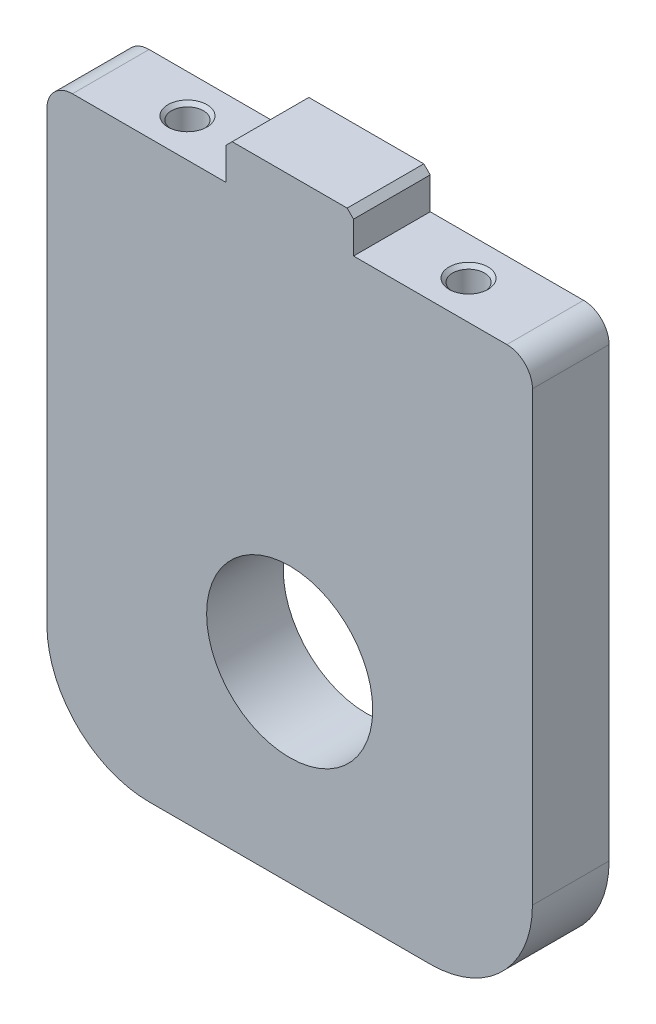
ISO-10303-21;
HEADER;
FILE_DESCRIPTION(('STEP AP214'),'2;1');
FILE_NAME('part.step','',(''),(''),'','','');
FILE_SCHEMA(('AUTOMOTIVE_DESIGN { 1 0 10303 214 1 1 1 1 }'));
ENDSEC;
DATA;
#1=APPLICATION_CONTEXT('core data for automotive mechanical design processes');
#2=APPLICATION_PROTOCOL_DEFINITION('international standard','automotive_design',2000,#1);
#3=PRODUCT_CONTEXT('',#1,'mechanical');
#4=PRODUCT('Part','Part','',(#3));
#5=PRODUCT_RELATED_PRODUCT_CATEGORY('part','',(#4));
#6=PRODUCT_DEFINITION_FORMATION('','',#4);
#7=PRODUCT_DEFINITION_CONTEXT('part definition',#1,'design');
#8=PRODUCT_DEFINITION('design','',#6,#7);
#9=PRODUCT_DEFINITION_SHAPE('','',#8);
#10=(LENGTH_UNIT() NAMED_UNIT(*) SI_UNIT(.MILLI.,.METRE.));
#11=(NAMED_UNIT(*) PLANE_ANGLE_UNIT() SI_UNIT($,.RADIAN.));
#12=(NAMED_UNIT(*) SI_UNIT($,.STERADIAN.) SOLID_ANGLE_UNIT());
#13=UNCERTAINTY_MEASURE_WITH_UNIT(LENGTH_MEASURE(1.E-05),#10,'distance_accuracy_value','');
#14=(GEOMETRIC_REPRESENTATION_CONTEXT(3) GLOBAL_UNCERTAINTY_ASSIGNED_CONTEXT((#13)) GLOBAL_UNIT_ASSIGNED_CONTEXT((#10,
#11,#12)) REPRESENTATION_CONTEXT('',''));
#15=CARTESIAN_POINT('',(0.,0.,0.));
#16=DIRECTION('',(0.,0.,1.));
#17=DIRECTION('',(1.,0.,0.));
#18=AXIS2_PLACEMENT_3D('',#15,#16,#17);
#19=CARTESIAN_POINT('',(-19.,22.5,6.));
#20=DIRECTION('',(0.,-1.,0.));
#21=DIRECTION('',(0.,0.,-1.));
#22=AXIS2_PLACEMENT_3D('',#19,#20,#21);
#23=PLANE('',#22);
#24=CARTESIAN_POINT('',(-11.,22.5,3.));
#25=DIRECTION('',(0.,1.,0.));
#26=DIRECTION('',(0.,0.,1.));
#27=AXIS2_PLACEMENT_3D('',#24,#25,#26);
#28=CIRCLE('',#27,1.525);
#29=CARTESIAN_POINT('',(-11.,22.5,4.525));
#30=VERTEX_POINT('',#29);
#31=EDGE_CURVE('E163',#30,#30,#28,.T.);
#32=ORIENTED_EDGE('',*,*,#31,.F.);
#33=EDGE_LOOP('',(#32));
#34=FACE_BOUND('',#33,.T.);
#35=DIRECTION('',(-1.,0.,0.));
#36=VECTOR('',#35,1.);
#37=CARTESIAN_POINT('',(-19.,22.5,6.));
#38=LINE('',#37,#36);
#39=CARTESIAN_POINT('',(-5.,22.5,6.));
#40=VERTEX_POINT('',#39);
#41=CARTESIAN_POINT('',(-17.,22.5,6.));
#42=VERTEX_POINT('',#41);
#43=EDGE_CURVE('E200',#40,#42,#38,.T.);
#44=ORIENTED_EDGE('',*,*,#43,.F.);
#45=DIRECTION('',(0.,0.,1.));
#46=VECTOR('',#45,1.);
#47=CARTESIAN_POINT('',(-5.,22.5,-10.4403065089105));
#48=LINE('',#47,#46);
#49=CARTESIAN_POINT('',(-5.,22.5,0.));
#50=VERTEX_POINT('',#49);
#51=EDGE_CURVE('E176',#50,#40,#48,.T.);
#52=ORIENTED_EDGE('',*,*,#51,.F.);
#53=DIRECTION('',(-1.,0.,0.));
#54=VECTOR('',#53,1.);
#55=CARTESIAN_POINT('',(-19.,22.5,0.));
#56=LINE('',#55,#54);
#57=CARTESIAN_POINT('',(-17.,22.5,0.));
#58=VERTEX_POINT('',#57);
#59=EDGE_CURVE('E213',#50,#58,#56,.T.);
#60=ORIENTED_EDGE('',*,*,#59,.T.);
#61=DIRECTION('',(0.,0.,-1.));
#62=VECTOR('',#61,1.);
#63=CARTESIAN_POINT('',(-17.,22.5,6.));
#64=LINE('',#63,#62);
#65=EDGE_CURVE('E233',#58,#42,#64,.F.);
#66=ORIENTED_EDGE('',*,*,#65,.T.);
#67=EDGE_LOOP('',(#44,#52,#60,#66));
#68=FACE_BOUND('',#67,.T.);
#69=ADVANCED_FACE('F39',(#34,#68),#23,.F.);
#70=CARTESIAN_POINT('',(19.,22.5,6.));
#71=DIRECTION('',(-1.,0.,0.));
#72=DIRECTION('',(0.,-1.,0.));
#73=AXIS2_PLACEMENT_3D('',#70,#71,#72);
#74=PLANE('',#73);
#75=DIRECTION('',(0.,1.,0.));
#76=VECTOR('',#75,1.);
#77=CARTESIAN_POINT('',(19.,22.5,6.));
#78=LINE('',#77,#76);
#79=CARTESIAN_POINT('',(19.,-14.5,6.));
#80=VERTEX_POINT('',#79);
#81=CARTESIAN_POINT('',(19.,20.5,6.));
#82=VERTEX_POINT('',#81);
#83=EDGE_CURVE('E198',#80,#82,#78,.T.);
#84=ORIENTED_EDGE('',*,*,#83,.F.);
#85=DIRECTION('',(0.,0.,-1.));
#86=VECTOR('',#85,1.);
#87=CARTESIAN_POINT('',(19.,-14.5,6.));
#88=LINE('',#87,#86);
#89=CARTESIAN_POINT('',(19.,-14.5,0.));
#90=VERTEX_POINT('',#89);
#91=EDGE_CURVE('E258',#80,#90,#88,.T.);
#92=ORIENTED_EDGE('',*,*,#91,.T.);
#93=DIRECTION('',(0.,1.,0.));
#94=VECTOR('',#93,1.);
#95=CARTESIAN_POINT('',(19.,22.5,0.));
#96=LINE('',#95,#94);
#97=CARTESIAN_POINT('',(19.,20.5,0.));
#98=VERTEX_POINT('',#97);
#99=EDGE_CURVE('E195',#90,#98,#96,.T.);
#100=ORIENTED_EDGE('',*,*,#99,.T.);
#101=DIRECTION('',(0.,0.,-1.));
#102=VECTOR('',#101,1.);
#103=CARTESIAN_POINT('',(19.,20.5,6.));
#104=LINE('',#103,#102);
#105=EDGE_CURVE('E240',#98,#82,#104,.F.);
#106=ORIENTED_EDGE('',*,*,#105,.T.);
#107=EDGE_LOOP('',(#84,#92,#100,#106));
#108=FACE_BOUND('',#107,.T.);
#109=ADVANCED_FACE('F320',(#108),#74,.F.);
#110=CARTESIAN_POINT('',(11.,22.5,3.));
#111=DIRECTION('',(0.,1.,0.));
#112=DIRECTION('',(0.,0.,1.));
#113=AXIS2_PLACEMENT_3D('',#110,#111,#112);
#114=CIRCLE('',#113,1.525);
#115=CARTESIAN_POINT('',(11.,22.5,4.525));
#116=VERTEX_POINT('',#115);
#117=EDGE_CURVE('E156',#116,#116,#114,.T.);
#118=ORIENTED_EDGE('',*,*,#117,.F.);
#119=EDGE_LOOP('',(#118));
#120=FACE_BOUND('',#119,.T.);
#121=CARTESIAN_POINT('',(17.,22.5,0.));
#122=VERTEX_POINT('',#121);
#123=CARTESIAN_POINT('',(5.,22.5,0.));
#124=VERTEX_POINT('',#123);
#125=EDGE_CURVE('E214',#122,#124,#56,.T.);
#126=ORIENTED_EDGE('',*,*,#125,.T.);
#127=DIRECTION('',(0.,0.,1.));
#128=VECTOR('',#127,1.);
#129=CARTESIAN_POINT('',(5.,22.5,-10.4403065089105));
#130=LINE('',#129,#128);
#131=CARTESIAN_POINT('',(5.,22.5,6.));
#132=VERTEX_POINT('',#131);
#133=EDGE_CURVE('E186',#124,#132,#130,.T.);
#134=ORIENTED_EDGE('',*,*,#133,.T.);
#135=CARTESIAN_POINT('',(17.,22.5,6.));
#136=VERTEX_POINT('',#135);
#137=EDGE_CURVE('E202',#136,#132,#38,.T.);
#138=ORIENTED_EDGE('',*,*,#137,.F.);
#139=DIRECTION('',(0.,0.,-1.));
#140=VECTOR('',#139,1.);
#141=CARTESIAN_POINT('',(17.,22.5,6.));
#142=LINE('',#141,#140);
#143=EDGE_CURVE('E230',#136,#122,#142,.T.);
#144=ORIENTED_EDGE('',*,*,#143,.T.);
#145=EDGE_LOOP('',(#126,#134,#138,#144));
#146=FACE_BOUND('',#145,.T.);
#147=ADVANCED_FACE('F329',(#120,#146),#23,.F.);
#148=CARTESIAN_POINT('',(-19.,22.5,6.));
#149=DIRECTION('',(1.,0.,0.));
#150=DIRECTION('',(0.,1.,0.));
#151=AXIS2_PLACEMENT_3D('',#148,#149,#150);
#152=PLANE('',#151);
#153=DIRECTION('',(0.,-1.,0.));
#154=VECTOR('',#153,1.);
#155=CARTESIAN_POINT('',(-19.,22.5,0.));
#156=LINE('',#155,#154);
#157=CARTESIAN_POINT('',(-19.,20.5,0.));
#158=VERTEX_POINT('',#157);
#159=CARTESIAN_POINT('',(-19.,-14.5,0.));
#160=VERTEX_POINT('',#159);
#161=EDGE_CURVE('E217',#158,#160,#156,.T.);
#162=ORIENTED_EDGE('',*,*,#161,.T.);
#163=DIRECTION('',(0.,0.,-1.));
#164=VECTOR('',#163,1.);
#165=CARTESIAN_POINT('',(-19.,-14.5,6.));
#166=LINE('',#165,#164);
#167=CARTESIAN_POINT('',(-19.,-14.5,6.));
#168=VERTEX_POINT('',#167);
#169=EDGE_CURVE('E252',#160,#168,#166,.F.);
#170=ORIENTED_EDGE('',*,*,#169,.T.);
#171=DIRECTION('',(0.,-1.,0.));
#172=VECTOR('',#171,1.);
#173=CARTESIAN_POINT('',(-19.,22.5,6.));
#174=LINE('',#173,#172);
#175=CARTESIAN_POINT('',(-19.,20.5,6.));
#176=VERTEX_POINT('',#175);
#177=EDGE_CURVE('E205',#176,#168,#174,.T.);
#178=ORIENTED_EDGE('',*,*,#177,.F.);
#179=DIRECTION('',(0.,0.,-1.));
#180=VECTOR('',#179,1.);
#181=CARTESIAN_POINT('',(-19.,20.5,6.));
#182=LINE('',#181,#180);
#183=EDGE_CURVE('E211',#176,#158,#182,.T.);
#184=ORIENTED_EDGE('',*,*,#183,.T.);
#185=EDGE_LOOP('',(#162,#170,#178,#184));
#186=FACE_BOUND('',#185,.T.);
#187=ADVANCED_FACE('F302',(#186),#152,.F.);
#188=CARTESIAN_POINT('',(-19.,-22.5,6.));
#189=DIRECTION('',(0.,1.,0.));
#190=DIRECTION('',(0.,0.,1.));
#191=AXIS2_PLACEMENT_3D('',#188,#189,#190);
#192=PLANE('',#191);
#193=DIRECTION('',(1.,0.,0.));
#194=VECTOR('',#193,1.);
#195=CARTESIAN_POINT('',(-19.,-22.5,6.));
#196=LINE('',#195,#194);
#197=CARTESIAN_POINT('',(-11.,-22.5,6.));
#198=VERTEX_POINT('',#197);
#199=CARTESIAN_POINT('',(11.,-22.5,6.));
#200=VERTEX_POINT('',#199);
#201=EDGE_CURVE('E208',#198,#200,#196,.T.);
#202=ORIENTED_EDGE('',*,*,#201,.F.);
#203=DIRECTION('',(0.,0.,-1.));
#204=VECTOR('',#203,1.);
#205=CARTESIAN_POINT('',(-11.,-22.5,6.));
#206=LINE('',#205,#204);
#207=CARTESIAN_POINT('',(-11.,-22.5,0.));
#208=VERTEX_POINT('',#207);
#209=EDGE_CURVE('E245',#198,#208,#206,.T.);
#210=ORIENTED_EDGE('',*,*,#209,.T.);
#211=DIRECTION('',(1.,0.,0.));
#212=VECTOR('',#211,1.);
#213=CARTESIAN_POINT('',(-19.,-22.5,0.));
#214=LINE('',#213,#212);
#215=CARTESIAN_POINT('',(11.,-22.5,0.));
#216=VERTEX_POINT('',#215);
#217=EDGE_CURVE('E201',#208,#216,#214,.T.);
#218=ORIENTED_EDGE('',*,*,#217,.T.);
#219=DIRECTION('',(0.,0.,-1.));
#220=VECTOR('',#219,1.);
#221=CARTESIAN_POINT('',(11.,-22.5,6.));
#222=LINE('',#221,#220);
#223=EDGE_CURVE('E243',#216,#200,#222,.F.);
#224=ORIENTED_EDGE('',*,*,#223,.T.);
#225=EDGE_LOOP('',(#202,#210,#218,#224));
#226=FACE_BOUND('',#225,.T.);
#227=ADVANCED_FACE('F313',(#226),#192,.F.);
#228=CARTESIAN_POINT('',(0.,0.,6.));
#229=DIRECTION('',(0.,0.,1.));
#230=DIRECTION('',(1.,0.,0.));
#231=AXIS2_PLACEMENT_3D('',#228,#229,#230);
#232=PLANE('',#231);
#233=CARTESIAN_POINT('',(0.,-7.5,6.));
#234=DIRECTION('',(0.,0.,1.));
#235=DIRECTION('',(1.,0.,0.));
#236=AXIS2_PLACEMENT_3D('',#233,#234,#235);
#237=CIRCLE('',#236,6.5);
#238=CARTESIAN_POINT('',(6.5,-7.5,6.));
#239=VERTEX_POINT('',#238);
#240=EDGE_CURVE('E191',#239,#239,#237,.T.);
#241=ORIENTED_EDGE('',*,*,#240,.F.);
#242=EDGE_LOOP('',(#241));
#243=FACE_BOUND('',#242,.T.);
#244=DIRECTION('',(0.,1.,0.));
#245=VECTOR('',#244,1.);
#246=CARTESIAN_POINT('',(5.,22.5,6.));
#247=LINE('',#246,#245);
#248=CARTESIAN_POINT('',(5.,25.,6.));
#249=VERTEX_POINT('',#248);
#250=EDGE_CURVE('E172',#132,#249,#247,.T.);
#251=ORIENTED_EDGE('',*,*,#250,.T.);
#252=DIRECTION('',(0.707106781186548,-0.707106781186548,0.));
#253=VECTOR('',#252,1.);
#254=CARTESIAN_POINT('',(15.,15.,6.));
#255=LINE('',#254,#253);
#256=CARTESIAN_POINT('',(4.5,25.5,6.));
#257=VERTEX_POINT('',#256);
#258=EDGE_CURVE('E266',#249,#257,#255,.F.);
#259=ORIENTED_EDGE('',*,*,#258,.T.);
#260=DIRECTION('',(-1.,0.,0.));
#261=VECTOR('',#260,1.);
#262=CARTESIAN_POINT('',(-5.,25.5,6.));
#263=LINE('',#262,#261);
#264=CARTESIAN_POINT('',(-4.49999999999999,25.5,6.));
#265=VERTEX_POINT('',#264);
#266=EDGE_CURVE('E181',#257,#265,#263,.T.);
#267=ORIENTED_EDGE('',*,*,#266,.T.);
#268=DIRECTION('',(0.707106781186548,0.707106781186548,0.));
#269=VECTOR('',#268,1.);
#270=CARTESIAN_POINT('',(-15.,15.,6.));
#271=LINE('',#270,#269);
#272=CARTESIAN_POINT('',(-5.,25.,6.));
#273=VERTEX_POINT('',#272);
#274=EDGE_CURVE('E264',#265,#273,#271,.F.);
#275=ORIENTED_EDGE('',*,*,#274,.T.);
#276=DIRECTION('',(0.,-1.,0.));
#277=VECTOR('',#276,1.);
#278=CARTESIAN_POINT('',(-5.,22.5,6.));
#279=LINE('',#278,#277);
#280=EDGE_CURVE('E184',#273,#40,#279,.T.);
#281=ORIENTED_EDGE('',*,*,#280,.T.);
#282=ORIENTED_EDGE('',*,*,#43,.T.);
#283=CARTESIAN_POINT('',(-17.,20.5,6.));
#284=DIRECTION('',(0.,0.,1.));
#285=DIRECTION('',(1.,0.,0.));
#286=AXIS2_PLACEMENT_3D('',#283,#284,#285);
#287=CIRCLE('',#286,2.);
#288=EDGE_CURVE('E238',#42,#176,#287,.T.);
#289=ORIENTED_EDGE('',*,*,#288,.T.);
#290=ORIENTED_EDGE('',*,*,#177,.T.);
#291=CARTESIAN_POINT('',(-11.,-14.5,6.));
#292=DIRECTION('',(0.,0.,1.));
#293=DIRECTION('',(1.,0.,0.));
#294=AXIS2_PLACEMENT_3D('',#291,#292,#293);
#295=CIRCLE('',#294,8.);
#296=EDGE_CURVE('E256',#168,#198,#295,.T.);
#297=ORIENTED_EDGE('',*,*,#296,.T.);
#298=ORIENTED_EDGE('',*,*,#201,.T.);
#299=CARTESIAN_POINT('',(11.,-14.5,6.));
#300=DIRECTION('',(0.,0.,1.));
#301=DIRECTION('',(1.,0.,0.));
#302=AXIS2_PLACEMENT_3D('',#299,#300,#301);
#303=CIRCLE('',#302,8.);
#304=EDGE_CURVE('E254',#200,#80,#303,.T.);
#305=ORIENTED_EDGE('',*,*,#304,.T.);
#306=ORIENTED_EDGE('',*,*,#83,.T.);
#307=CARTESIAN_POINT('',(17.,20.5,6.));
#308=DIRECTION('',(0.,0.,1.));
#309=DIRECTION('',(1.,0.,0.));
#310=AXIS2_PLACEMENT_3D('',#307,#308,#309);
#311=CIRCLE('',#310,2.);
#312=EDGE_CURVE('E236',#82,#136,#311,.T.);
#313=ORIENTED_EDGE('',*,*,#312,.T.);
#314=ORIENTED_EDGE('',*,*,#137,.T.);
#315=EDGE_LOOP('',(#251,#259,#267,#275,#281,#282,#289,#290,#297,#298,#305,#306,#313,#314));
#316=FACE_BOUND('',#315,.T.);
#317=ADVANCED_FACE('F286',(#243,#316),#232,.T.);
#318=CARTESIAN_POINT('',(0.,0.,0.));
#319=DIRECTION('',(0.,0.,1.));
#320=DIRECTION('',(1.,0.,0.));
#321=AXIS2_PLACEMENT_3D('',#318,#319,#320);
#322=PLANE('',#321);
#323=CARTESIAN_POINT('',(0.,-7.5,0.));
#324=DIRECTION('',(0.,0.,1.));
#325=DIRECTION('',(1.,0.,0.));
#326=AXIS2_PLACEMENT_3D('',#323,#324,#325);
#327=CIRCLE('',#326,6.5);
#328=CARTESIAN_POINT('',(6.5,-7.5,0.));
#329=VERTEX_POINT('',#328);
#330=EDGE_CURVE('E192',#329,#329,#327,.T.);
#331=ORIENTED_EDGE('',*,*,#330,.T.);
#332=EDGE_LOOP('',(#331));
#333=FACE_BOUND('',#332,.T.);
#334=DIRECTION('',(1.,0.,0.));
#335=VECTOR('',#334,1.);
#336=CARTESIAN_POINT('',(-5.,25.5,0.));
#337=LINE('',#336,#335);
#338=CARTESIAN_POINT('',(-4.49999999999999,25.5,0.));
#339=VERTEX_POINT('',#338);
#340=CARTESIAN_POINT('',(4.5,25.5,0.));
#341=VERTEX_POINT('',#340);
#342=EDGE_CURVE('E173',#339,#341,#337,.T.);
#343=ORIENTED_EDGE('',*,*,#342,.T.);
#344=DIRECTION('',(-0.707106781186548,0.707106781186548,0.));
#345=VECTOR('',#344,1.);
#346=CARTESIAN_POINT('',(5.,25.,0.));
#347=LINE('',#346,#345);
#348=CARTESIAN_POINT('',(5.,25.,0.));
#349=VERTEX_POINT('',#348);
#350=EDGE_CURVE('E47',#341,#349,#347,.F.);
#351=ORIENTED_EDGE('',*,*,#350,.T.);
#352=DIRECTION('',(0.,-1.,0.));
#353=VECTOR('',#352,1.);
#354=CARTESIAN_POINT('',(5.,22.5,0.));
#355=LINE('',#354,#353);
#356=EDGE_CURVE('E178',#349,#124,#355,.T.);
#357=ORIENTED_EDGE('',*,*,#356,.T.);
#358=ORIENTED_EDGE('',*,*,#125,.F.);
#359=CARTESIAN_POINT('',(17.,20.5,0.));
#360=DIRECTION('',(0.,0.,1.));
#361=DIRECTION('',(1.,0.,0.));
#362=AXIS2_PLACEMENT_3D('',#359,#360,#361);
#363=CIRCLE('',#362,2.);
#364=EDGE_CURVE('E224',#122,#98,#363,.F.);
#365=ORIENTED_EDGE('',*,*,#364,.T.);
#366=ORIENTED_EDGE('',*,*,#99,.F.);
#367=CARTESIAN_POINT('',(11.,-14.5,0.));
#368=DIRECTION('',(0.,0.,1.));
#369=DIRECTION('',(1.,0.,0.));
#370=AXIS2_PLACEMENT_3D('',#367,#368,#369);
#371=CIRCLE('',#370,8.);
#372=EDGE_CURVE('E248',#90,#216,#371,.F.);
#373=ORIENTED_EDGE('',*,*,#372,.T.);
#374=ORIENTED_EDGE('',*,*,#217,.F.);
#375=CARTESIAN_POINT('',(-11.,-14.5,0.));
#376=DIRECTION('',(0.,0.,1.));
#377=DIRECTION('',(1.,0.,0.));
#378=AXIS2_PLACEMENT_3D('',#375,#376,#377);
#379=CIRCLE('',#378,8.);
#380=EDGE_CURVE('E250',#208,#160,#379,.F.);
#381=ORIENTED_EDGE('',*,*,#380,.T.);
#382=ORIENTED_EDGE('',*,*,#161,.F.);
#383=CARTESIAN_POINT('',(-17.,20.5,0.));
#384=DIRECTION('',(0.,0.,1.));
#385=DIRECTION('',(1.,0.,0.));
#386=AXIS2_PLACEMENT_3D('',#383,#384,#385);
#387=CIRCLE('',#386,2.);
#388=EDGE_CURVE('E227',#158,#58,#387,.F.);
#389=ORIENTED_EDGE('',*,*,#388,.T.);
#390=ORIENTED_EDGE('',*,*,#59,.F.);
#391=DIRECTION('',(0.,1.,0.));
#392=VECTOR('',#391,1.);
#393=CARTESIAN_POINT('',(-5.,22.5,0.));
#394=LINE('',#393,#392);
#395=CARTESIAN_POINT('',(-5.,25.,0.));
#396=VERTEX_POINT('',#395);
#397=EDGE_CURVE('E175',#50,#396,#394,.T.);
#398=ORIENTED_EDGE('',*,*,#397,.T.);
#399=DIRECTION('',(-0.707106781186548,-0.707106781186548,0.));
#400=VECTOR('',#399,1.);
#401=CARTESIAN_POINT('',(-4.49999999999999,25.5,0.));
#402=LINE('',#401,#400);
#403=EDGE_CURVE('E272',#396,#339,#402,.F.);
#404=ORIENTED_EDGE('',*,*,#403,.T.);
#405=EDGE_LOOP('',(#343,#351,#357,#358,#365,#366,#373,#374,#381,#382,#389,#390,#398,#404));
#406=FACE_BOUND('',#405,.T.);
#407=ADVANCED_FACE('F276',(#333,#406),#322,.F.);
#408=CARTESIAN_POINT('',(0.,-7.5,0.));
#409=DIRECTION('',(0.,0.,1.));
#410=DIRECTION('',(1.,0.,0.));
#411=AXIS2_PLACEMENT_3D('',#408,#409,#410);
#412=CYLINDRICAL_SURFACE('',#411,6.5);
#413=ORIENTED_EDGE('',*,*,#330,.F.);
#414=EDGE_LOOP('',(#413));
#415=FACE_BOUND('',#414,.T.);
#416=ORIENTED_EDGE('',*,*,#240,.T.);
#417=EDGE_LOOP('',(#416));
#418=FACE_BOUND('',#417,.T.);
#419=ADVANCED_FACE('F374',(#415,#418),#412,.F.);
#420=CARTESIAN_POINT('',(-17.,20.5,6.));
#421=DIRECTION('',(0.,0.,-1.));
#422=DIRECTION('',(-1.,0.,0.));
#423=AXIS2_PLACEMENT_3D('',#420,#421,#422);
#424=CYLINDRICAL_SURFACE('',#423,2.);
#425=ORIENTED_EDGE('',*,*,#288,.F.);
#426=ORIENTED_EDGE('',*,*,#65,.F.);
#427=ORIENTED_EDGE('',*,*,#388,.F.);
#428=ORIENTED_EDGE('',*,*,#183,.F.);
#429=EDGE_LOOP('',(#425,#426,#427,#428));
#430=FACE_BOUND('',#429,.T.);
#431=ADVANCED_FACE('F305',(#430),#424,.T.);
#432=CARTESIAN_POINT('',(17.,20.5,6.));
#433=DIRECTION('',(0.,0.,-1.));
#434=DIRECTION('',(-1.,0.,0.));
#435=AXIS2_PLACEMENT_3D('',#432,#433,#434);
#436=CYLINDRICAL_SURFACE('',#435,2.);
#437=ORIENTED_EDGE('',*,*,#312,.F.);
#438=ORIENTED_EDGE('',*,*,#105,.F.);
#439=ORIENTED_EDGE('',*,*,#364,.F.);
#440=ORIENTED_EDGE('',*,*,#143,.F.);
#441=EDGE_LOOP('',(#437,#438,#439,#440));
#442=FACE_BOUND('',#441,.T.);
#443=ADVANCED_FACE('F326',(#442),#436,.T.);
#444=CARTESIAN_POINT('',(-11.,-14.5,6.));
#445=DIRECTION('',(0.,0.,-1.));
#446=DIRECTION('',(-1.,0.,0.));
#447=AXIS2_PLACEMENT_3D('',#444,#445,#446);
#448=CYLINDRICAL_SURFACE('',#447,8.);
#449=ORIENTED_EDGE('',*,*,#296,.F.);
#450=ORIENTED_EDGE('',*,*,#169,.F.);
#451=ORIENTED_EDGE('',*,*,#380,.F.);
#452=ORIENTED_EDGE('',*,*,#209,.F.);
#453=EDGE_LOOP('',(#449,#450,#451,#452));
#454=FACE_BOUND('',#453,.T.);
#455=ADVANCED_FACE('F308',(#454),#448,.T.);
#456=CARTESIAN_POINT('',(11.,-14.5,6.));
#457=DIRECTION('',(0.,0.,-1.));
#458=DIRECTION('',(-1.,0.,0.));
#459=AXIS2_PLACEMENT_3D('',#456,#457,#458);
#460=CYLINDRICAL_SURFACE('',#459,8.);
#461=ORIENTED_EDGE('',*,*,#304,.F.);
#462=ORIENTED_EDGE('',*,*,#223,.F.);
#463=ORIENTED_EDGE('',*,*,#372,.F.);
#464=ORIENTED_EDGE('',*,*,#91,.F.);
#465=EDGE_LOOP('',(#461,#462,#463,#464));
#466=FACE_BOUND('',#465,.T.);
#467=ADVANCED_FACE('F316',(#466),#460,.T.);
#468=CARTESIAN_POINT('',(-5.,22.5,-10.4403065089105));
#469=DIRECTION('',(-1.,0.,0.));
#470=DIRECTION('',(0.,-1.,0.));
#471=AXIS2_PLACEMENT_3D('',#468,#469,#470);
#472=PLANE('',#471);
#473=ORIENTED_EDGE('',*,*,#280,.F.);
#474=DIRECTION('',(0.,0.,-1.));
#475=VECTOR('',#474,1.);
#476=CARTESIAN_POINT('',(-5.,25.,-10.4403065089105));
#477=LINE('',#476,#475);
#478=EDGE_CURVE('E11',#273,#396,#477,.T.);
#479=ORIENTED_EDGE('',*,*,#478,.T.);
#480=ORIENTED_EDGE('',*,*,#397,.F.);
#481=ORIENTED_EDGE('',*,*,#51,.T.);
#482=EDGE_LOOP('',(#473,#479,#480,#481));
#483=FACE_BOUND('',#482,.T.);
#484=ADVANCED_FACE('F292',(#483),#472,.T.);
#485=CARTESIAN_POINT('',(-5.,25.5,-10.4403065089105));
#486=DIRECTION('',(0.,1.,0.));
#487=DIRECTION('',(0.,0.,1.));
#488=AXIS2_PLACEMENT_3D('',#485,#486,#487);
#489=PLANE('',#488);
#490=ORIENTED_EDGE('',*,*,#266,.F.);
#491=DIRECTION('',(0.,0.,-1.));
#492=VECTOR('',#491,1.);
#493=CARTESIAN_POINT('',(4.5,25.5,-10.4403065089105));
#494=LINE('',#493,#492);
#495=EDGE_CURVE('E60',#257,#341,#494,.T.);
#496=ORIENTED_EDGE('',*,*,#495,.T.);
#497=ORIENTED_EDGE('',*,*,#342,.F.);
#498=DIRECTION('',(0.,0.,1.));
#499=VECTOR('',#498,1.);
#500=CARTESIAN_POINT('',(-4.49999999999999,25.5,-10.4403065089105));
#501=LINE('',#500,#499);
#502=EDGE_CURVE('E268',#339,#265,#501,.T.);
#503=ORIENTED_EDGE('',*,*,#502,.T.);
#504=EDGE_LOOP('',(#490,#496,#497,#503));
#505=FACE_BOUND('',#504,.T.);
#506=ADVANCED_FACE('F287',(#505),#489,.T.);
#507=CARTESIAN_POINT('',(5.,22.5,-10.4403065089105));
#508=DIRECTION('',(1.,0.,0.));
#509=DIRECTION('',(0.,1.,0.));
#510=AXIS2_PLACEMENT_3D('',#507,#508,#509);
#511=PLANE('',#510);
#512=ORIENTED_EDGE('',*,*,#356,.F.);
#513=DIRECTION('',(0.,0.,1.));
#514=VECTOR('',#513,1.);
#515=CARTESIAN_POINT('',(5.,25.,-10.4403065089105));
#516=LINE('',#515,#514);
#517=EDGE_CURVE('E261',#349,#249,#516,.T.);
#518=ORIENTED_EDGE('',*,*,#517,.T.);
#519=ORIENTED_EDGE('',*,*,#250,.F.);
#520=ORIENTED_EDGE('',*,*,#133,.F.);
#521=EDGE_LOOP('',(#512,#518,#519,#520));
#522=FACE_BOUND('',#521,.T.);
#523=ADVANCED_FACE('F282',(#522),#511,.T.);
#524=CARTESIAN_POINT('',(5.,25.,-10.4403065089105));
#525=DIRECTION('',(-0.707106781186547,-0.707106781186547,0.));
#526=DIRECTION('',(0.,0.,1.));
#527=AXIS2_PLACEMENT_3D('',#524,#525,#526);
#528=PLANE('',#527);
#529=ORIENTED_EDGE('',*,*,#350,.F.);
#530=ORIENTED_EDGE('',*,*,#495,.F.);
#531=ORIENTED_EDGE('',*,*,#258,.F.);
#532=ORIENTED_EDGE('',*,*,#517,.F.);
#533=EDGE_LOOP('',(#529,#530,#531,#532));
#534=FACE_BOUND('',#533,.T.);
#535=ADVANCED_FACE('F284',(#534),#528,.F.);
#536=CARTESIAN_POINT('',(-4.49999999999999,25.5,-10.4403065089105));
#537=DIRECTION('',(0.707106781186547,-0.707106781186547,0.));
#538=DIRECTION('',(0.,0.,1.));
#539=AXIS2_PLACEMENT_3D('',#536,#537,#538);
#540=PLANE('',#539);
#541=ORIENTED_EDGE('',*,*,#403,.F.);
#542=ORIENTED_EDGE('',*,*,#478,.F.);
#543=ORIENTED_EDGE('',*,*,#274,.F.);
#544=ORIENTED_EDGE('',*,*,#502,.F.);
#545=EDGE_LOOP('',(#541,#542,#543,#544));
#546=FACE_BOUND('',#545,.T.);
#547=ADVANCED_FACE('F41',(#546),#540,.F.);
#548=CARTESIAN_POINT('',(11.,15.,3.));
#549=DIRECTION('',(0.,1.,0.));
#550=DIRECTION('',(0.,0.,1.));
#551=AXIS2_PLACEMENT_3D('',#548,#549,#550);
#552=CONICAL_SURFACE('',#551,1.24999999999999,1.02974425867664);
#553=CARTESIAN_POINT('',(11.,14.2489242262155,3.));
#554=VERTEX_POINT('',#553);
#555=VERTEX_LOOP('',#554);
#556=FACE_BOUND('',#555,.T.);
#557=CARTESIAN_POINT('',(11.,15.,3.));
#558=DIRECTION('',(0.,1.,0.));
#559=DIRECTION('',(0.,0.,1.));
#560=AXIS2_PLACEMENT_3D('',#557,#558,#559);
#561=CIRCLE('',#560,1.24999999999999);
#562=CARTESIAN_POINT('',(11.,15.,4.24999999999999));
#563=VERTEX_POINT('',#562);
#564=EDGE_CURVE('E169',#563,#563,#561,.T.);
#565=ORIENTED_EDGE('',*,*,#564,.T.);
#566=EDGE_LOOP('',(#565));
#567=FACE_BOUND('',#566,.T.);
#568=ADVANCED_FACE('F363',(#556,#567),#552,.F.);
#569=CARTESIAN_POINT('',(11.,22.5,3.));
#570=DIRECTION('',(0.,1.,0.));
#571=DIRECTION('',(0.,0.,1.));
#572=AXIS2_PLACEMENT_3D('',#569,#570,#571);
#573=CYLINDRICAL_SURFACE('',#572,1.24999999999999);
#574=ORIENTED_EDGE('',*,*,#564,.F.);
#575=EDGE_LOOP('',(#574));
#576=FACE_BOUND('',#575,.T.);
#577=CARTESIAN_POINT('',(11.,22.225,3.));
#578=DIRECTION('',(0.,1.,0.));
#579=DIRECTION('',(0.,0.,1.));
#580=AXIS2_PLACEMENT_3D('',#577,#578,#579);
#581=CIRCLE('',#580,1.24999999999999);
#582=CARTESIAN_POINT('',(11.,22.225,4.24999999999999));
#583=VERTEX_POINT('',#582);
#584=EDGE_CURVE('E160',#583,#583,#581,.T.);
#585=ORIENTED_EDGE('',*,*,#584,.T.);
#586=EDGE_LOOP('',(#585));
#587=FACE_BOUND('',#586,.T.);
#588=ADVANCED_FACE('F359',(#576,#587),#573,.F.);
#589=CARTESIAN_POINT('',(11.,22.5,3.));
#590=DIRECTION('',(0.,1.,0.));
#591=DIRECTION('',(0.,0.,1.));
#592=AXIS2_PLACEMENT_3D('',#589,#590,#591);
#593=CONICAL_SURFACE('',#592,1.525,0.785398163397467);
#594=ORIENTED_EDGE('',*,*,#584,.F.);
#595=EDGE_LOOP('',(#594));
#596=FACE_BOUND('',#595,.T.);
#597=ORIENTED_EDGE('',*,*,#117,.T.);
#598=EDGE_LOOP('',(#597));
#599=FACE_BOUND('',#598,.T.);
#600=ADVANCED_FACE('F150',(#596,#599),#593,.F.);
#601=CARTESIAN_POINT('',(-11.,15.,3.));
#602=DIRECTION('',(0.,1.,0.));
#603=DIRECTION('',(0.,0.,1.));
#604=AXIS2_PLACEMENT_3D('',#601,#602,#603);
#605=CONICAL_SURFACE('',#604,1.24999999999999,1.02974425867664);
#606=CARTESIAN_POINT('',(-11.,14.2489242262155,3.));
#607=VERTEX_POINT('',#606);
#608=VERTEX_LOOP('',#607);
#609=FACE_BOUND('',#608,.T.);
#610=CARTESIAN_POINT('',(-11.,15.,3.));
#611=DIRECTION('',(0.,1.,0.));
#612=DIRECTION('',(0.,0.,1.));
#613=AXIS2_PLACEMENT_3D('',#610,#611,#612);
#614=CIRCLE('',#613,1.24999999999999);
#615=CARTESIAN_POINT('',(-11.,15.,4.24999999999999));
#616=VERTEX_POINT('',#615);
#617=EDGE_CURVE('E154',#616,#616,#614,.T.);
#618=ORIENTED_EDGE('',*,*,#617,.T.);
#619=EDGE_LOOP('',(#618));
#620=FACE_BOUND('',#619,.T.);
#621=ADVANCED_FACE('F146',(#609,#620),#605,.F.);
#622=CARTESIAN_POINT('',(-11.,22.5,3.));
#623=DIRECTION('',(0.,1.,0.));
#624=DIRECTION('',(0.,0.,1.));
#625=AXIS2_PLACEMENT_3D('',#622,#623,#624);
#626=CYLINDRICAL_SURFACE('',#625,1.24999999999999);
#627=ORIENTED_EDGE('',*,*,#617,.F.);
#628=EDGE_LOOP('',(#627));
#629=FACE_BOUND('',#628,.T.);
#630=CARTESIAN_POINT('',(-11.,22.225,3.));
#631=DIRECTION('',(0.,1.,0.));
#632=DIRECTION('',(0.,0.,1.));
#633=AXIS2_PLACEMENT_3D('',#630,#631,#632);
#634=CIRCLE('',#633,1.24999999999999);
#635=CARTESIAN_POINT('',(-11.,22.225,4.24999999999999));
#636=VERTEX_POINT('',#635);
#637=EDGE_CURVE('E157',#636,#636,#634,.T.);
#638=ORIENTED_EDGE('',*,*,#637,.T.);
#639=EDGE_LOOP('',(#638));
#640=FACE_BOUND('',#639,.T.);
#641=ADVANCED_FACE('F149',(#629,#640),#626,.F.);
#642=CARTESIAN_POINT('',(-11.,22.5,3.));
#643=DIRECTION('',(0.,1.,0.));
#644=DIRECTION('',(0.,0.,1.));
#645=AXIS2_PLACEMENT_3D('',#642,#643,#644);
#646=CONICAL_SURFACE('',#645,1.525,0.785398163397467);
#647=ORIENTED_EDGE('',*,*,#637,.F.);
#648=EDGE_LOOP('',(#647));
#649=FACE_BOUND('',#648,.T.);
#650=ORIENTED_EDGE('',*,*,#31,.T.);
#651=EDGE_LOOP('',(#650));
#652=FACE_BOUND('',#651,.T.);
#653=ADVANCED_FACE('F347',(#649,#652),#646,.F.);
#654=CLOSED_SHELL('',(#69,#109,#147,#187,#227,#317,#407,#419,#431,#443,#455,#467,#484,#506,#523,
#535,#547,#568,#588,#600,#621,#641,#653));
#655=MANIFOLD_SOLID_BREP('B2',#654);
#656=ADVANCED_BREP_SHAPE_REPRESENTATION('',(#18,#655),#14);
#657=SHAPE_DEFINITION_REPRESENTATION(#9,#656);
ENDSEC;
END-ISO-10303-21;
